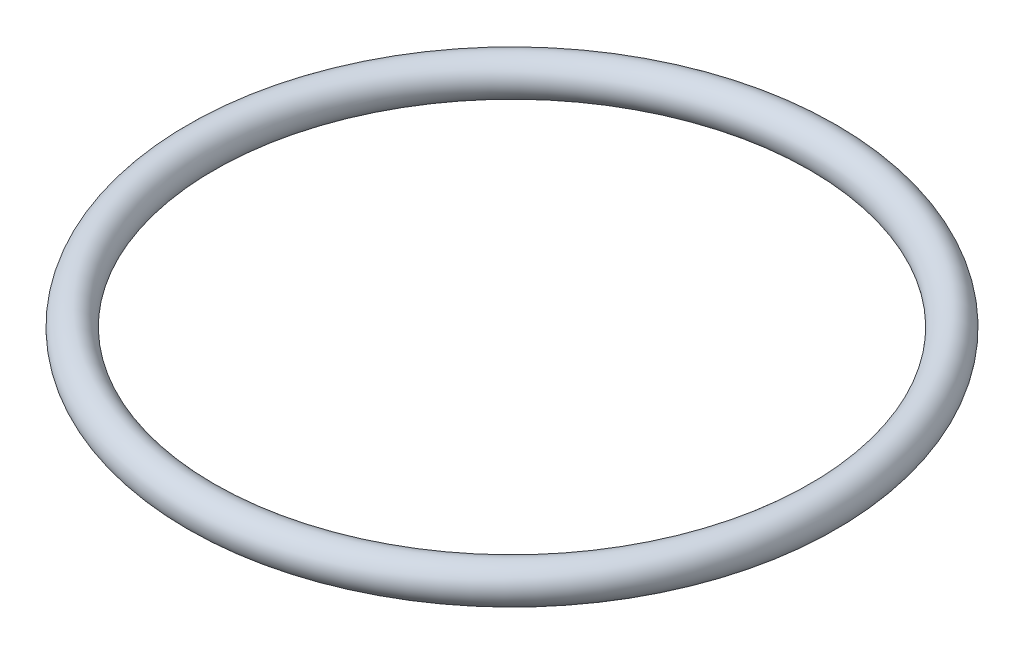
ISO-10303-21;
HEADER;
FILE_DESCRIPTION(('STEP AP214'),'2;1');
FILE_NAME('part.step','',(''),(''),'','','');
FILE_SCHEMA(('AUTOMOTIVE_DESIGN { 1 0 10303 214 1 1 1 1 }'));
ENDSEC;
DATA;
#1=APPLICATION_CONTEXT('core data for automotive mechanical design processes');
#2=APPLICATION_PROTOCOL_DEFINITION('international standard','automotive_design',2000,#1);
#3=PRODUCT_CONTEXT('',#1,'mechanical');
#4=PRODUCT('Part','Part','',(#3));
#5=PRODUCT_RELATED_PRODUCT_CATEGORY('part','',(#4));
#6=PRODUCT_DEFINITION_FORMATION('','',#4);
#7=PRODUCT_DEFINITION_CONTEXT('part definition',#1,'design');
#8=PRODUCT_DEFINITION('design','',#6,#7);
#9=PRODUCT_DEFINITION_SHAPE('','',#8);
#10=(LENGTH_UNIT() NAMED_UNIT(*) SI_UNIT(.MILLI.,.METRE.));
#11=(NAMED_UNIT(*) PLANE_ANGLE_UNIT() SI_UNIT($,.RADIAN.));
#12=(NAMED_UNIT(*) SI_UNIT($,.STERADIAN.) SOLID_ANGLE_UNIT());
#13=UNCERTAINTY_MEASURE_WITH_UNIT(LENGTH_MEASURE(1.E-05),#10,'distance_accuracy_value','');
#14=(GEOMETRIC_REPRESENTATION_CONTEXT(3) GLOBAL_UNCERTAINTY_ASSIGNED_CONTEXT((#13)) GLOBAL_UNIT_ASSIGNED_CONTEXT((#10,
#11,#12)) REPRESENTATION_CONTEXT('',''));
#15=CARTESIAN_POINT('',(0.,0.,0.));
#16=DIRECTION('',(0.,0.,1.));
#17=DIRECTION('',(1.,0.,0.));
#18=AXIS2_PLACEMENT_3D('',#15,#16,#17);
#19=CARTESIAN_POINT('',(0.,0.,0.));
#20=DIRECTION('',(0.,-1.,0.));
#21=DIRECTION('',(0.,0.,-1.));
#22=AXIS2_PLACEMENT_3D('',#19,#20,#21);
#23=TOROIDAL_SURFACE('',#22,43.5102,2.5908);
#24=CARTESIAN_POINT('',(0.,0.,-46.101));
#25=VERTEX_POINT('',#24);
#26=VERTEX_LOOP('',#25);
#27=FACE_BOUND('',#26,.T.);
#28=ADVANCED_FACE('F35',(#27),#23,.T.);
#29=CLOSED_SHELL('',(#28));
#30=MANIFOLD_SOLID_BREP('B2',#29);
#31=ADVANCED_BREP_SHAPE_REPRESENTATION('',(#18,#30),#14);
#32=SHAPE_DEFINITION_REPRESENTATION(#9,#31);
ENDSEC;
END-ISO-10303-21;
